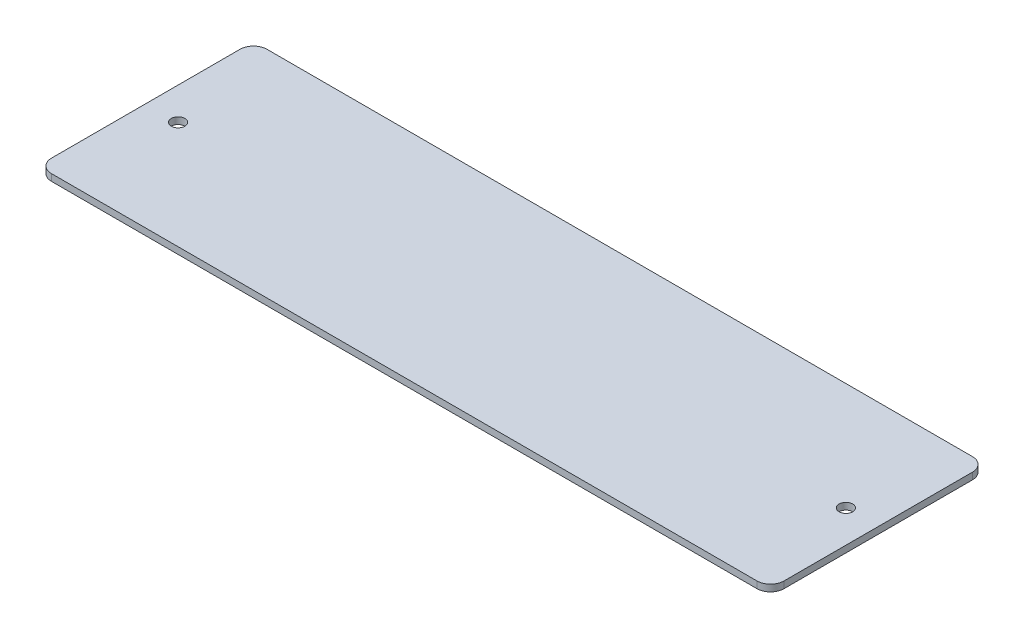
ISO-10303-21;
HEADER;
FILE_DESCRIPTION(('STEP AP214'),'2;1');
FILE_NAME('part.step','',(''),(''),'','','');
FILE_SCHEMA(('AUTOMOTIVE_DESIGN { 1 0 10303 214 1 1 1 1 }'));
ENDSEC;
DATA;
#1=APPLICATION_CONTEXT('core data for automotive mechanical design processes');
#2=APPLICATION_PROTOCOL_DEFINITION('international standard','automotive_design',2000,#1);
#3=PRODUCT_CONTEXT('',#1,'mechanical');
#4=PRODUCT('Part','Part','',(#3));
#5=PRODUCT_RELATED_PRODUCT_CATEGORY('part','',(#4));
#6=PRODUCT_DEFINITION_FORMATION('','',#4);
#7=PRODUCT_DEFINITION_CONTEXT('part definition',#1,'design');
#8=PRODUCT_DEFINITION('design','',#6,#7);
#9=PRODUCT_DEFINITION_SHAPE('','',#8);
#10=(LENGTH_UNIT() NAMED_UNIT(*) SI_UNIT(.MILLI.,.METRE.));
#11=(NAMED_UNIT(*) PLANE_ANGLE_UNIT() SI_UNIT($,.RADIAN.));
#12=(NAMED_UNIT(*) SI_UNIT($,.STERADIAN.) SOLID_ANGLE_UNIT());
#13=UNCERTAINTY_MEASURE_WITH_UNIT(LENGTH_MEASURE(1.E-05),#10,'distance_accuracy_value','');
#14=(GEOMETRIC_REPRESENTATION_CONTEXT(3) GLOBAL_UNCERTAINTY_ASSIGNED_CONTEXT((#13)) GLOBAL_UNIT_ASSIGNED_CONTEXT((#10,
#11,#12)) REPRESENTATION_CONTEXT('',''));
#15=CARTESIAN_POINT('',(0.,0.,0.));
#16=DIRECTION('',(0.,0.,1.));
#17=DIRECTION('',(1.,0.,0.));
#18=AXIS2_PLACEMENT_3D('',#15,#16,#17);
#19=CARTESIAN_POINT('',(0.,1.5875,0.));
#20=DIRECTION('',(0.,-1.,0.));
#21=DIRECTION('',(0.,0.,-1.));
#22=AXIS2_PLACEMENT_3D('',#19,#20,#21);
#23=PLANE('',#22);
#24=DIRECTION('',(0.,0.,-1.));
#25=VECTOR('',#24,1.);
#26=CARTESIAN_POINT('',(86.36,1.5875,25.4));
#27=LINE('',#26,#25);
#28=CARTESIAN_POINT('',(86.36,1.5875,22.225));
#29=VERTEX_POINT('',#28);
#30=CARTESIAN_POINT('',(86.36,1.5875,-22.225));
#31=VERTEX_POINT('',#30);
#32=EDGE_CURVE('E144',#29,#31,#27,.T.);
#33=ORIENTED_EDGE('',*,*,#32,.T.);
#34=CARTESIAN_POINT('',(83.1850000000001,1.5875,-22.225));
#35=DIRECTION('',(0.,-1.,0.));
#36=DIRECTION('',(0.,0.,-1.));
#37=AXIS2_PLACEMENT_3D('',#34,#35,#36);
#38=CIRCLE('',#37,3.175);
#39=CARTESIAN_POINT('',(83.1850000000001,1.5875,-25.4));
#40=VERTEX_POINT('',#39);
#41=EDGE_CURVE('E158',#31,#40,#38,.F.);
#42=ORIENTED_EDGE('',*,*,#41,.T.);
#43=DIRECTION('',(-1.,0.,0.));
#44=VECTOR('',#43,1.);
#45=CARTESIAN_POINT('',(-86.3599999999999,1.5875,-25.4));
#46=LINE('',#45,#44);
#47=CARTESIAN_POINT('',(-83.1849999999999,1.5875,-25.4));
#48=VERTEX_POINT('',#47);
#49=EDGE_CURVE('E125',#40,#48,#46,.T.);
#50=ORIENTED_EDGE('',*,*,#49,.T.);
#51=CARTESIAN_POINT('',(-83.1849999999999,1.5875,-22.225));
#52=DIRECTION('',(0.,-1.,0.));
#53=DIRECTION('',(0.,0.,-1.));
#54=AXIS2_PLACEMENT_3D('',#51,#52,#53);
#55=CIRCLE('',#54,3.175);
#56=CARTESIAN_POINT('',(-86.3599999999999,1.5875,-22.225));
#57=VERTEX_POINT('',#56);
#58=EDGE_CURVE('E154',#48,#57,#55,.F.);
#59=ORIENTED_EDGE('',*,*,#58,.T.);
#60=DIRECTION('',(0.,0.,1.));
#61=VECTOR('',#60,1.);
#62=CARTESIAN_POINT('',(-86.3599999999999,1.5875,25.4));
#63=LINE('',#62,#61);
#64=CARTESIAN_POINT('',(-86.3599999999999,1.5875,22.225));
#65=VERTEX_POINT('',#64);
#66=EDGE_CURVE('E167',#57,#65,#63,.T.);
#67=ORIENTED_EDGE('',*,*,#66,.T.);
#68=CARTESIAN_POINT('',(-83.1849999999999,1.5875,22.225));
#69=DIRECTION('',(0.,-1.,0.));
#70=DIRECTION('',(0.,0.,-1.));
#71=AXIS2_PLACEMENT_3D('',#68,#69,#70);
#72=CIRCLE('',#71,3.175);
#73=CARTESIAN_POINT('',(-83.1849999999999,1.5875,25.4));
#74=VERTEX_POINT('',#73);
#75=EDGE_CURVE('E60',#65,#74,#72,.F.);
#76=ORIENTED_EDGE('',*,*,#75,.T.);
#77=DIRECTION('',(1.,0.,0.));
#78=VECTOR('',#77,1.);
#79=CARTESIAN_POINT('',(-86.3599999999999,1.5875,25.4));
#80=LINE('',#79,#78);
#81=CARTESIAN_POINT('',(83.1850000000001,1.5875,25.4));
#82=VERTEX_POINT('',#81);
#83=EDGE_CURVE('E145',#74,#82,#80,.T.);
#84=ORIENTED_EDGE('',*,*,#83,.T.);
#85=CARTESIAN_POINT('',(83.185,1.5875,22.225));
#86=DIRECTION('',(0.,-1.,0.));
#87=DIRECTION('',(0.,0.,-1.));
#88=AXIS2_PLACEMENT_3D('',#85,#86,#87);
#89=CIRCLE('',#88,3.175);
#90=EDGE_CURVE('E156',#82,#29,#89,.F.);
#91=ORIENTED_EDGE('',*,*,#90,.T.);
#92=EDGE_LOOP('',(#33,#42,#50,#59,#67,#76,#84,#91));
#93=FACE_BOUND('',#92,.T.);
#94=CARTESIAN_POINT('',(-78.74,1.5875,0.));
#95=DIRECTION('',(0.,1.,0.));
#96=DIRECTION('',(0.,0.,1.));
#97=AXIS2_PLACEMENT_3D('',#94,#95,#96);
#98=CIRCLE('',#97,1.6002);
#99=CARTESIAN_POINT('',(-78.74,1.5875,1.60020000000001));
#100=VERTEX_POINT('',#99);
#101=EDGE_CURVE('E139',#100,#100,#98,.T.);
#102=ORIENTED_EDGE('',*,*,#101,.F.);
#103=EDGE_LOOP('',(#102));
#104=FACE_BOUND('',#103,.T.);
#105=CARTESIAN_POINT('',(78.74,1.5875,0.));
#106=DIRECTION('',(0.,1.,0.));
#107=DIRECTION('',(0.,0.,1.));
#108=AXIS2_PLACEMENT_3D('',#105,#106,#107);
#109=CIRCLE('',#108,1.6002);
#110=CARTESIAN_POINT('',(78.74,1.5875,1.60019999999996));
#111=VERTEX_POINT('',#110);
#112=EDGE_CURVE('E190',#111,#111,#109,.T.);
#113=ORIENTED_EDGE('',*,*,#112,.F.);
#114=EDGE_LOOP('',(#113));
#115=FACE_BOUND('',#114,.T.);
#116=ADVANCED_FACE('F38',(#93,#104,#115),#23,.F.);
#117=CARTESIAN_POINT('',(0.,0.,0.));
#118=DIRECTION('',(0.,-1.,0.));
#119=DIRECTION('',(0.,0.,-1.));
#120=AXIS2_PLACEMENT_3D('',#117,#118,#119);
#121=PLANE('',#120);
#122=CARTESIAN_POINT('',(-78.74,0.,0.));
#123=DIRECTION('',(0.,1.,0.));
#124=DIRECTION('',(0.,0.,1.));
#125=AXIS2_PLACEMENT_3D('',#122,#123,#124);
#126=CIRCLE('',#125,1.6002);
#127=CARTESIAN_POINT('',(-78.74,0.,1.60020000000001));
#128=VERTEX_POINT('',#127);
#129=EDGE_CURVE('E187',#128,#128,#126,.T.);
#130=ORIENTED_EDGE('',*,*,#129,.T.);
#131=EDGE_LOOP('',(#130));
#132=FACE_BOUND('',#131,.T.);
#133=DIRECTION('',(-1.,0.,0.));
#134=VECTOR('',#133,1.);
#135=CARTESIAN_POINT('',(-86.3599999999999,0.,-25.4));
#136=LINE('',#135,#134);
#137=CARTESIAN_POINT('',(83.1850000000001,0.,-25.4));
#138=VERTEX_POINT('',#137);
#139=CARTESIAN_POINT('',(-83.1849999999999,0.,-25.4));
#140=VERTEX_POINT('',#139);
#141=EDGE_CURVE('E122',#138,#140,#136,.T.);
#142=ORIENTED_EDGE('',*,*,#141,.F.);
#143=CARTESIAN_POINT('',(83.1850000000001,0.,-22.225));
#144=DIRECTION('',(0.,-1.,0.));
#145=DIRECTION('',(0.,0.,-1.));
#146=AXIS2_PLACEMENT_3D('',#143,#144,#145);
#147=CIRCLE('',#146,3.175);
#148=CARTESIAN_POINT('',(86.36,0.,-22.225));
#149=VERTEX_POINT('',#148);
#150=EDGE_CURVE('E105',#138,#149,#147,.T.);
#151=ORIENTED_EDGE('',*,*,#150,.T.);
#152=DIRECTION('',(0.,0.,-1.));
#153=VECTOR('',#152,1.);
#154=CARTESIAN_POINT('',(86.36,0.,25.4));
#155=LINE('',#154,#153);
#156=CARTESIAN_POINT('',(86.36,0.,22.225));
#157=VERTEX_POINT('',#156);
#158=EDGE_CURVE('E134',#157,#149,#155,.T.);
#159=ORIENTED_EDGE('',*,*,#158,.F.);
#160=CARTESIAN_POINT('',(83.185,0.,22.225));
#161=DIRECTION('',(0.,-1.,0.));
#162=DIRECTION('',(0.,0.,-1.));
#163=AXIS2_PLACEMENT_3D('',#160,#161,#162);
#164=CIRCLE('',#163,3.175);
#165=CARTESIAN_POINT('',(83.1850000000001,0.,25.4));
#166=VERTEX_POINT('',#165);
#167=EDGE_CURVE('E116',#157,#166,#164,.T.);
#168=ORIENTED_EDGE('',*,*,#167,.T.);
#169=DIRECTION('',(1.,0.,0.));
#170=VECTOR('',#169,1.);
#171=CARTESIAN_POINT('',(-86.3599999999999,0.,25.4));
#172=LINE('',#171,#170);
#173=CARTESIAN_POINT('',(-83.1849999999999,0.,25.4));
#174=VERTEX_POINT('',#173);
#175=EDGE_CURVE('E137',#174,#166,#172,.T.);
#176=ORIENTED_EDGE('',*,*,#175,.F.);
#177=CARTESIAN_POINT('',(-83.1849999999999,0.,22.225));
#178=DIRECTION('',(0.,-1.,0.));
#179=DIRECTION('',(0.,0.,-1.));
#180=AXIS2_PLACEMENT_3D('',#177,#178,#179);
#181=CIRCLE('',#180,3.175);
#182=CARTESIAN_POINT('',(-86.3599999999999,0.,22.225));
#183=VERTEX_POINT('',#182);
#184=EDGE_CURVE('E126',#174,#183,#181,.T.);
#185=ORIENTED_EDGE('',*,*,#184,.T.);
#186=DIRECTION('',(0.,0.,1.));
#187=VECTOR('',#186,1.);
#188=CARTESIAN_POINT('',(-86.3599999999999,0.,25.4));
#189=LINE('',#188,#187);
#190=CARTESIAN_POINT('',(-86.3599999999999,0.,-22.225));
#191=VERTEX_POINT('',#190);
#192=EDGE_CURVE('E133',#191,#183,#189,.T.);
#193=ORIENTED_EDGE('',*,*,#192,.F.);
#194=CARTESIAN_POINT('',(-83.1849999999999,0.,-22.225));
#195=DIRECTION('',(0.,-1.,0.));
#196=DIRECTION('',(0.,0.,-1.));
#197=AXIS2_PLACEMENT_3D('',#194,#195,#196);
#198=CIRCLE('',#197,3.175);
#199=EDGE_CURVE('E132',#191,#140,#198,.T.);
#200=ORIENTED_EDGE('',*,*,#199,.T.);
#201=EDGE_LOOP('',(#142,#151,#159,#168,#176,#185,#193,#200));
#202=FACE_BOUND('',#201,.T.);
#203=CARTESIAN_POINT('',(78.74,0.,0.));
#204=DIRECTION('',(0.,1.,0.));
#205=DIRECTION('',(0.,0.,1.));
#206=AXIS2_PLACEMENT_3D('',#203,#204,#205);
#207=CIRCLE('',#206,1.6002);
#208=CARTESIAN_POINT('',(78.74,0.,1.60019999999996));
#209=VERTEX_POINT('',#208);
#210=EDGE_CURVE('E193',#209,#209,#207,.T.);
#211=ORIENTED_EDGE('',*,*,#210,.T.);
#212=EDGE_LOOP('',(#211));
#213=FACE_BOUND('',#212,.T.);
#214=ADVANCED_FACE('F129',(#132,#202,#213),#121,.T.);
#215=CARTESIAN_POINT('',(86.36,1.5875,25.4));
#216=DIRECTION('',(-1.,0.,0.));
#217=DIRECTION('',(0.,0.,1.));
#218=AXIS2_PLACEMENT_3D('',#215,#216,#217);
#219=PLANE('',#218);
#220=ORIENTED_EDGE('',*,*,#158,.T.);
#221=DIRECTION('',(0.,-1.,0.));
#222=VECTOR('',#221,1.);
#223=CARTESIAN_POINT('',(86.36,1.5875,-22.225));
#224=LINE('',#223,#222);
#225=EDGE_CURVE('E110',#149,#31,#224,.F.);
#226=ORIENTED_EDGE('',*,*,#225,.T.);
#227=ORIENTED_EDGE('',*,*,#32,.F.);
#228=DIRECTION('',(0.,-1.,0.));
#229=VECTOR('',#228,1.);
#230=CARTESIAN_POINT('',(86.36,1.5875,22.225));
#231=LINE('',#230,#229);
#232=EDGE_CURVE('E115',#29,#157,#231,.T.);
#233=ORIENTED_EDGE('',*,*,#232,.T.);
#234=EDGE_LOOP('',(#220,#226,#227,#233));
#235=FACE_BOUND('',#234,.T.);
#236=ADVANCED_FACE('F183',(#235),#219,.F.);
#237=CARTESIAN_POINT('',(-86.3599999999999,1.5875,-25.4));
#238=DIRECTION('',(0.,0.,1.));
#239=DIRECTION('',(1.,0.,0.));
#240=AXIS2_PLACEMENT_3D('',#237,#238,#239);
#241=PLANE('',#240);
#242=ORIENTED_EDGE('',*,*,#49,.F.);
#243=DIRECTION('',(0.,-1.,0.));
#244=VECTOR('',#243,1.);
#245=CARTESIAN_POINT('',(83.1850000000001,1.5875,-25.4));
#246=LINE('',#245,#244);
#247=EDGE_CURVE('E109',#40,#138,#246,.T.);
#248=ORIENTED_EDGE('',*,*,#247,.T.);
#249=ORIENTED_EDGE('',*,*,#141,.T.);
#250=DIRECTION('',(0.,-1.,0.));
#251=VECTOR('',#250,1.);
#252=CARTESIAN_POINT('',(-83.1849999999999,1.5875,-25.4));
#253=LINE('',#252,#251);
#254=EDGE_CURVE('E127',#140,#48,#253,.F.);
#255=ORIENTED_EDGE('',*,*,#254,.T.);
#256=EDGE_LOOP('',(#242,#248,#249,#255));
#257=FACE_BOUND('',#256,.T.);
#258=ADVANCED_FACE('F121',(#257),#241,.F.);
#259=CARTESIAN_POINT('',(-86.3599999999999,1.5875,25.4));
#260=DIRECTION('',(1.,0.,0.));
#261=DIRECTION('',(0.,0.,-1.));
#262=AXIS2_PLACEMENT_3D('',#259,#260,#261);
#263=PLANE('',#262);
#264=ORIENTED_EDGE('',*,*,#66,.F.);
#265=DIRECTION('',(0.,-1.,0.));
#266=VECTOR('',#265,1.);
#267=CARTESIAN_POINT('',(-86.3599999999999,1.5875,-22.225));
#268=LINE('',#267,#266);
#269=EDGE_CURVE('E11',#57,#191,#268,.T.);
#270=ORIENTED_EDGE('',*,*,#269,.T.);
#271=ORIENTED_EDGE('',*,*,#192,.T.);
#272=DIRECTION('',(0.,-1.,0.));
#273=VECTOR('',#272,1.);
#274=CARTESIAN_POINT('',(-86.3599999999999,1.5875,22.225));
#275=LINE('',#274,#273);
#276=EDGE_CURVE('E46',#183,#65,#275,.F.);
#277=ORIENTED_EDGE('',*,*,#276,.T.);
#278=EDGE_LOOP('',(#264,#270,#271,#277));
#279=FACE_BOUND('',#278,.T.);
#280=ADVANCED_FACE('F166',(#279),#263,.F.);
#281=CARTESIAN_POINT('',(-86.3599999999999,1.5875,25.4));
#282=DIRECTION('',(0.,0.,-1.));
#283=DIRECTION('',(-1.,0.,0.));
#284=AXIS2_PLACEMENT_3D('',#281,#282,#283);
#285=PLANE('',#284);
#286=ORIENTED_EDGE('',*,*,#175,.T.);
#287=DIRECTION('',(0.,-1.,0.));
#288=VECTOR('',#287,1.);
#289=CARTESIAN_POINT('',(83.1850000000001,1.5875,25.4));
#290=LINE('',#289,#288);
#291=EDGE_CURVE('E53',#166,#82,#290,.F.);
#292=ORIENTED_EDGE('',*,*,#291,.T.);
#293=ORIENTED_EDGE('',*,*,#83,.F.);
#294=DIRECTION('',(0.,-1.,0.));
#295=VECTOR('',#294,1.);
#296=CARTESIAN_POINT('',(-83.1849999999999,1.5875,25.4));
#297=LINE('',#296,#295);
#298=EDGE_CURVE('E160',#74,#174,#297,.T.);
#299=ORIENTED_EDGE('',*,*,#298,.T.);
#300=EDGE_LOOP('',(#286,#292,#293,#299));
#301=FACE_BOUND('',#300,.T.);
#302=ADVANCED_FACE('F176',(#301),#285,.F.);
#303=CARTESIAN_POINT('',(-78.74,1.5875,0.));
#304=DIRECTION('',(0.,-1.,0.));
#305=DIRECTION('',(0.,0.,-1.));
#306=AXIS2_PLACEMENT_3D('',#303,#304,#305);
#307=CYLINDRICAL_SURFACE('',#306,1.6002);
#308=ORIENTED_EDGE('',*,*,#101,.T.);
#309=EDGE_LOOP('',(#308));
#310=FACE_BOUND('',#309,.T.);
#311=ORIENTED_EDGE('',*,*,#129,.F.);
#312=EDGE_LOOP('',(#311));
#313=FACE_BOUND('',#312,.T.);
#314=ADVANCED_FACE('F209',(#310,#313),#307,.F.);
#315=CARTESIAN_POINT('',(78.74,1.5875,0.));
#316=DIRECTION('',(0.,-1.,0.));
#317=DIRECTION('',(0.,0.,-1.));
#318=AXIS2_PLACEMENT_3D('',#315,#316,#317);
#319=CYLINDRICAL_SURFACE('',#318,1.6002);
#320=ORIENTED_EDGE('',*,*,#112,.T.);
#321=EDGE_LOOP('',(#320));
#322=FACE_BOUND('',#321,.T.);
#323=ORIENTED_EDGE('',*,*,#210,.F.);
#324=EDGE_LOOP('',(#323));
#325=FACE_BOUND('',#324,.T.);
#326=ADVANCED_FACE('F199',(#322,#325),#319,.F.);
#327=CARTESIAN_POINT('',(83.1850000000001,1.5875,-22.225));
#328=DIRECTION('',(0.,-1.,0.));
#329=DIRECTION('',(0.,0.,-1.));
#330=AXIS2_PLACEMENT_3D('',#327,#328,#329);
#331=CYLINDRICAL_SURFACE('',#330,3.175);
#332=ORIENTED_EDGE('',*,*,#41,.F.);
#333=ORIENTED_EDGE('',*,*,#225,.F.);
#334=ORIENTED_EDGE('',*,*,#150,.F.);
#335=ORIENTED_EDGE('',*,*,#247,.F.);
#336=EDGE_LOOP('',(#332,#333,#334,#335));
#337=FACE_BOUND('',#336,.T.);
#338=ADVANCED_FACE('F108',(#337),#331,.T.);
#339=CARTESIAN_POINT('',(83.185,1.5875,22.225));
#340=DIRECTION('',(0.,-1.,0.));
#341=DIRECTION('',(0.,0.,-1.));
#342=AXIS2_PLACEMENT_3D('',#339,#340,#341);
#343=CYLINDRICAL_SURFACE('',#342,3.175);
#344=ORIENTED_EDGE('',*,*,#90,.F.);
#345=ORIENTED_EDGE('',*,*,#291,.F.);
#346=ORIENTED_EDGE('',*,*,#167,.F.);
#347=ORIENTED_EDGE('',*,*,#232,.F.);
#348=EDGE_LOOP('',(#344,#345,#346,#347));
#349=FACE_BOUND('',#348,.T.);
#350=ADVANCED_FACE('F180',(#349),#343,.T.);
#351=CARTESIAN_POINT('',(-83.1849999999999,1.5875,-22.225));
#352=DIRECTION('',(0.,-1.,0.));
#353=DIRECTION('',(0.,0.,-1.));
#354=AXIS2_PLACEMENT_3D('',#351,#352,#353);
#355=CYLINDRICAL_SURFACE('',#354,3.175);
#356=ORIENTED_EDGE('',*,*,#58,.F.);
#357=ORIENTED_EDGE('',*,*,#254,.F.);
#358=ORIENTED_EDGE('',*,*,#199,.F.);
#359=ORIENTED_EDGE('',*,*,#269,.F.);
#360=EDGE_LOOP('',(#356,#357,#358,#359));
#361=FACE_BOUND('',#360,.T.);
#362=ADVANCED_FACE('F223',(#361),#355,.T.);
#363=CARTESIAN_POINT('',(-83.1849999999999,1.5875,22.225));
#364=DIRECTION('',(0.,-1.,0.));
#365=DIRECTION('',(0.,0.,-1.));
#366=AXIS2_PLACEMENT_3D('',#363,#364,#365);
#367=CYLINDRICAL_SURFACE('',#366,3.175);
#368=ORIENTED_EDGE('',*,*,#75,.F.);
#369=ORIENTED_EDGE('',*,*,#276,.F.);
#370=ORIENTED_EDGE('',*,*,#184,.F.);
#371=ORIENTED_EDGE('',*,*,#298,.F.);
#372=EDGE_LOOP('',(#368,#369,#370,#371));
#373=FACE_BOUND('',#372,.T.);
#374=ADVANCED_FACE('F40',(#373),#367,.T.);
#375=CLOSED_SHELL('',(#116,#214,#236,#258,#280,#302,#314,#326,#338,#350,#362,#374));
#376=MANIFOLD_SOLID_BREP('B2',#375);
#377=ADVANCED_BREP_SHAPE_REPRESENTATION('',(#18,#376),#14);
#378=SHAPE_DEFINITION_REPRESENTATION(#9,#377);
ENDSEC;
END-ISO-10303-21;
